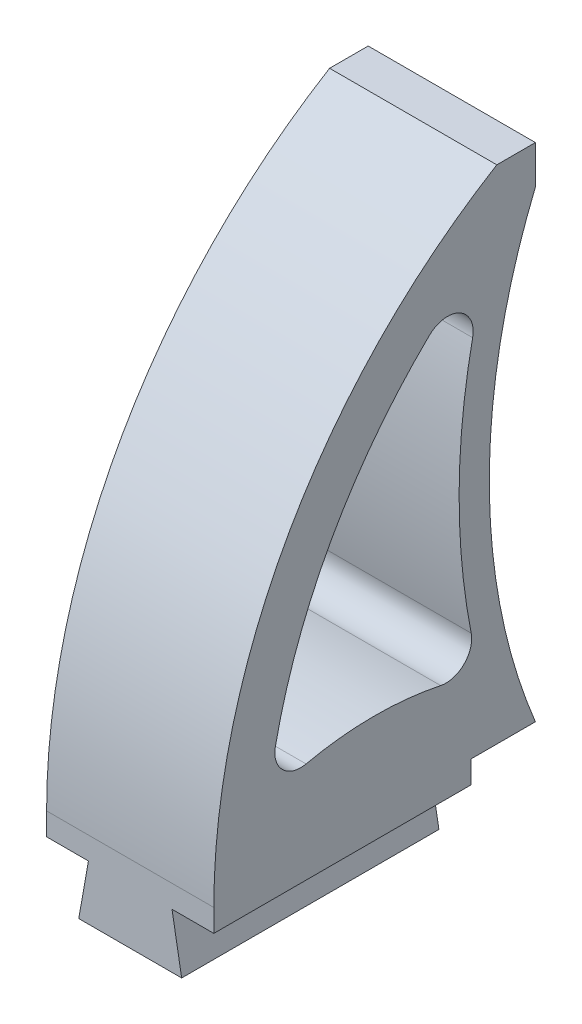
ISO-10303-21;
HEADER;
FILE_DESCRIPTION(('STEP AP214'),'2;1');
FILE_NAME('part.step','',(''),(''),'','','');
FILE_SCHEMA(('AUTOMOTIVE_DESIGN { 1 0 10303 214 1 1 1 1 }'));
ENDSEC;
DATA;
#1=APPLICATION_CONTEXT('core data for automotive mechanical design processes');
#2=APPLICATION_PROTOCOL_DEFINITION('international standard','automotive_design',2000,#1);
#3=PRODUCT_CONTEXT('',#1,'mechanical');
#4=PRODUCT('Part','Part','',(#3));
#5=PRODUCT_RELATED_PRODUCT_CATEGORY('part','',(#4));
#6=PRODUCT_DEFINITION_FORMATION('','',#4);
#7=PRODUCT_DEFINITION_CONTEXT('part definition',#1,'design');
#8=PRODUCT_DEFINITION('design','',#6,#7);
#9=PRODUCT_DEFINITION_SHAPE('','',#8);
#10=(LENGTH_UNIT() NAMED_UNIT(*) SI_UNIT(.MILLI.,.METRE.));
#11=(NAMED_UNIT(*) PLANE_ANGLE_UNIT() SI_UNIT($,.RADIAN.));
#12=(NAMED_UNIT(*) SI_UNIT($,.STERADIAN.) SOLID_ANGLE_UNIT());
#13=UNCERTAINTY_MEASURE_WITH_UNIT(LENGTH_MEASURE(1.E-05),#10,'distance_accuracy_value','');
#14=(GEOMETRIC_REPRESENTATION_CONTEXT(3) GLOBAL_UNCERTAINTY_ASSIGNED_CONTEXT((#13)) GLOBAL_UNIT_ASSIGNED_CONTEXT((#10,
#11,#12)) REPRESENTATION_CONTEXT('',''));
#15=CARTESIAN_POINT('',(0.,0.,0.));
#16=DIRECTION('',(0.,0.,1.));
#17=DIRECTION('',(1.,0.,0.));
#18=AXIS2_PLACEMENT_3D('',#15,#16,#17);
#19=CARTESIAN_POINT('',(6.5,0.,-20.));
#20=DIRECTION('',(0.,1.,0.));
#21=DIRECTION('',(0.,0.,1.));
#22=AXIS2_PLACEMENT_3D('',#19,#20,#21);
#23=PLANE('',#22);
#24=DIRECTION('',(0.,0.,1.));
#25=VECTOR('',#24,1.);
#26=CARTESIAN_POINT('',(-3.99999999999999,0.,-25.001));
#27=LINE('',#26,#25);
#28=CARTESIAN_POINT('',(-3.99999999999999,0.,-20.));
#29=VERTEX_POINT('',#28);
#30=CARTESIAN_POINT('',(-3.99999999999999,0.,0.));
#31=VERTEX_POINT('',#30);
#32=EDGE_CURVE('E223',#29,#31,#27,.T.);
#33=ORIENTED_EDGE('',*,*,#32,.F.);
#34=DIRECTION('',(-1.,0.,0.));
#35=VECTOR('',#34,1.);
#36=CARTESIAN_POINT('',(6.5,0.,-20.));
#37=LINE('',#36,#35);
#38=CARTESIAN_POINT('',(4.,0.,-20.));
#39=VERTEX_POINT('',#38);
#40=EDGE_CURVE('E11',#39,#29,#37,.T.);
#41=ORIENTED_EDGE('',*,*,#40,.F.);
#42=DIRECTION('',(0.,0.,1.));
#43=VECTOR('',#42,1.);
#44=CARTESIAN_POINT('',(4.,0.,-25.001));
#45=LINE('',#44,#43);
#46=CARTESIAN_POINT('',(4.,0.,0.));
#47=VERTEX_POINT('',#46);
#48=EDGE_CURVE('E234',#39,#47,#45,.T.);
#49=ORIENTED_EDGE('',*,*,#48,.T.);
#50=DIRECTION('',(-1.,0.,0.));
#51=VECTOR('',#50,1.);
#52=CARTESIAN_POINT('',(6.5,0.,0.));
#53=LINE('',#52,#51);
#54=EDGE_CURVE('E264',#47,#31,#53,.T.);
#55=ORIENTED_EDGE('',*,*,#54,.T.);
#56=EDGE_LOOP('',(#33,#41,#49,#55));
#57=FACE_BOUND('',#56,.T.);
#58=ADVANCED_FACE('F39',(#57),#23,.F.);
#59=CARTESIAN_POINT('',(6.5,6.,-20.));
#60=DIRECTION('',(0.,0.,1.));
#61=DIRECTION('',(1.,0.,0.));
#62=AXIS2_PLACEMENT_3D('',#59,#60,#61);
#63=PLANE('',#62);
#64=DIRECTION('',(0.173648177666928,0.984807753012208,0.));
#65=VECTOR('',#64,1.);
#66=CARTESIAN_POINT('',(-3.87938524157182,0.684040286651327,-20.));
#67=LINE('',#66,#65);
#68=CARTESIAN_POINT('',(-3.25000000000003,4.25346136471315,-20.));
#69=VERTEX_POINT('',#68);
#70=EDGE_CURVE('E212',#29,#69,#67,.T.);
#71=ORIENTED_EDGE('',*,*,#70,.T.);
#72=DIRECTION('',(-1.,0.,0.));
#73=VECTOR('',#72,1.);
#74=CARTESIAN_POINT('',(0.,4.25346136471317,-20.));
#75=LINE('',#74,#73);
#76=CARTESIAN_POINT('',(-6.5,4.25346136471313,-20.));
#77=VERTEX_POINT('',#76);
#78=EDGE_CURVE('E225',#69,#77,#75,.T.);
#79=ORIENTED_EDGE('',*,*,#78,.T.);
#80=DIRECTION('',(0.,1.,0.));
#81=VECTOR('',#80,1.);
#82=CARTESIAN_POINT('',(-6.5,6.,-20.));
#83=LINE('',#82,#81);
#84=CARTESIAN_POINT('',(-6.5,6.,-20.));
#85=VERTEX_POINT('',#84);
#86=EDGE_CURVE('E232',#77,#85,#83,.T.);
#87=ORIENTED_EDGE('',*,*,#86,.T.);
#88=DIRECTION('',(-1.,0.,0.));
#89=VECTOR('',#88,1.);
#90=CARTESIAN_POINT('',(6.5,6.,-20.));
#91=LINE('',#90,#89);
#92=CARTESIAN_POINT('',(6.5,6.,-20.));
#93=VERTEX_POINT('',#92);
#94=EDGE_CURVE('E46',#93,#85,#91,.T.);
#95=ORIENTED_EDGE('',*,*,#94,.F.);
#96=DIRECTION('',(0.,1.,0.));
#97=VECTOR('',#96,1.);
#98=CARTESIAN_POINT('',(6.5,6.,-20.));
#99=LINE('',#98,#97);
#100=CARTESIAN_POINT('',(6.5,4.25346136471317,-20.));
#101=VERTEX_POINT('',#100);
#102=EDGE_CURVE('E248',#101,#93,#99,.T.);
#103=ORIENTED_EDGE('',*,*,#102,.F.);
#104=DIRECTION('',(1.,0.,0.));
#105=VECTOR('',#104,1.);
#106=CARTESIAN_POINT('',(6.5,4.25346136471317,-20.));
#107=LINE('',#106,#105);
#108=CARTESIAN_POINT('',(3.25,4.25346136471317,-20.));
#109=VERTEX_POINT('',#108);
#110=EDGE_CURVE('E177',#109,#101,#107,.T.);
#111=ORIENTED_EDGE('',*,*,#110,.F.);
#112=DIRECTION('',(-0.173648177666935,0.984807753012207,0.));
#113=VECTOR('',#112,1.);
#114=CARTESIAN_POINT('',(3.25,4.25346136471317,-20.));
#115=LINE('',#114,#113);
#116=EDGE_CURVE('E216',#39,#109,#115,.T.);
#117=ORIENTED_EDGE('',*,*,#116,.F.);
#118=ORIENTED_EDGE('',*,*,#40,.T.);
#119=EDGE_LOOP('',(#71,#79,#87,#95,#103,#111,#117,#118));
#120=FACE_BOUND('',#119,.T.);
#121=ADVANCED_FACE('F321',(#120),#63,.F.);
#122=CARTESIAN_POINT('',(6.5,0.,0.));
#123=DIRECTION('',(0.,0.,-1.));
#124=DIRECTION('',(-1.,0.,0.));
#125=AXIS2_PLACEMENT_3D('',#122,#123,#124);
#126=PLANE('',#125);
#127=DIRECTION('',(-0.173648177666928,-0.984807753012208,0.));
#128=VECTOR('',#127,1.);
#129=CARTESIAN_POINT('',(-3.87938524157182,0.684040286651327,0.));
#130=LINE('',#129,#128);
#131=CARTESIAN_POINT('',(-3.25000000000003,4.25346136471315,0.));
#132=VERTEX_POINT('',#131);
#133=EDGE_CURVE('E215',#132,#31,#130,.T.);
#134=ORIENTED_EDGE('',*,*,#133,.T.);
#135=ORIENTED_EDGE('',*,*,#54,.F.);
#136=DIRECTION('',(0.173648177666935,-0.984807753012207,0.));
#137=VECTOR('',#136,1.);
#138=CARTESIAN_POINT('',(3.25,4.25346136471317,0.));
#139=LINE('',#138,#137);
#140=CARTESIAN_POINT('',(3.25,4.25346136471317,0.));
#141=VERTEX_POINT('',#140);
#142=EDGE_CURVE('E244',#141,#47,#139,.T.);
#143=ORIENTED_EDGE('',*,*,#142,.F.);
#144=DIRECTION('',(-1.,0.,0.));
#145=VECTOR('',#144,1.);
#146=CARTESIAN_POINT('',(6.5,4.25346136471317,0.));
#147=LINE('',#146,#145);
#148=CARTESIAN_POINT('',(6.5,4.25346136471317,0.));
#149=VERTEX_POINT('',#148);
#150=EDGE_CURVE('E241',#149,#141,#147,.T.);
#151=ORIENTED_EDGE('',*,*,#150,.F.);
#152=DIRECTION('',(0.,-1.,0.));
#153=VECTOR('',#152,1.);
#154=CARTESIAN_POINT('',(6.5,0.,0.));
#155=LINE('',#154,#153);
#156=CARTESIAN_POINT('',(6.5,6.,0.));
#157=VERTEX_POINT('',#156);
#158=EDGE_CURVE('E261',#157,#149,#155,.T.);
#159=ORIENTED_EDGE('',*,*,#158,.F.);
#160=DIRECTION('',(-1.,0.,0.));
#161=VECTOR('',#160,1.);
#162=CARTESIAN_POINT('',(6.5,6.,0.));
#163=LINE('',#162,#161);
#164=CARTESIAN_POINT('',(-6.5,6.,0.));
#165=VERTEX_POINT('',#164);
#166=EDGE_CURVE('E280',#157,#165,#163,.T.);
#167=ORIENTED_EDGE('',*,*,#166,.T.);
#168=DIRECTION('',(0.,-1.,0.));
#169=VECTOR('',#168,1.);
#170=CARTESIAN_POINT('',(-6.5,0.,0.));
#171=LINE('',#170,#169);
#172=CARTESIAN_POINT('',(-6.5,4.25346136471315,0.));
#173=VERTEX_POINT('',#172);
#174=EDGE_CURVE('E251',#165,#173,#171,.T.);
#175=ORIENTED_EDGE('',*,*,#174,.T.);
#176=DIRECTION('',(1.,0.,0.));
#177=VECTOR('',#176,1.);
#178=CARTESIAN_POINT('',(0.,4.25346136471317,0.));
#179=LINE('',#178,#177);
#180=EDGE_CURVE('E219',#173,#132,#179,.T.);
#181=ORIENTED_EDGE('',*,*,#180,.T.);
#182=EDGE_LOOP('',(#134,#135,#143,#151,#159,#167,#175,#181));
#183=FACE_BOUND('',#182,.T.);
#184=ADVANCED_FACE('F334',(#183),#126,.F.);
#185=CARTESIAN_POINT('',(-6.5,6.,-45.5681818181818));
#186=DIRECTION('',(1.,0.,0.));
#187=DIRECTION('',(0.,0.,-1.));
#188=AXIS2_PLACEMENT_3D('',#185,#186,#187);
#189=PLANE('',#188);
#190=CARTESIAN_POINT('',(-6.5,24.1044855795233,-69.070297770506));
#191=DIRECTION('',(1.,0.,0.));
#192=DIRECTION('',(0.,0.,-1.));
#193=AXIS2_PLACEMENT_3D('',#190,#191,#192);
#194=CIRCLE('',#193,50.);
#195=CARTESIAN_POINT('',(-6.5,34.3028962432529,-20.1214221967614));
#196=VERTEX_POINT('',#195);
#197=CARTESIAN_POINT('',(-6.5,14.4638203331186,-20.0085247327654));
#198=VERTEX_POINT('',#197);
#199=EDGE_CURVE('E184',#196,#198,#194,.T.);
#200=ORIENTED_EDGE('',*,*,#199,.F.);
#201=CARTESIAN_POINT('',(-6.5,34.7108326698021,-18.1634671738116));
#202=DIRECTION('',(1.,0.,0.));
#203=DIRECTION('',(0.,0.,-1.));
#204=AXIS2_PLACEMENT_3D('',#201,#202,#203);
#205=CIRCLE('',#204,2.);
#206=CARTESIAN_POINT('',(-6.5,36.1515813933143,-16.7762962702464));
#207=VERTEX_POINT('',#206);
#208=EDGE_CURVE('E165',#207,#196,#205,.F.);
#209=ORIENTED_EDGE('',*,*,#208,.F.);
#210=CARTESIAN_POINT('',(-6.5,5.89585819955734,-45.9068852451154));
#211=DIRECTION('',(1.,0.,0.));
#212=DIRECTION('',(0.,0.,-1.));
#213=AXIS2_PLACEMENT_3D('',#210,#211,#212);
#214=CIRCLE('',#213,42.);
#215=CARTESIAN_POINT('',(-6.5,14.4399701025535,-4.78513732763162));
#216=VERTEX_POINT('',#215);
#217=EDGE_CURVE('E174',#216,#207,#214,.F.);
#218=ORIENTED_EDGE('',*,*,#217,.F.);
#219=CARTESIAN_POINT('',(-6.5,14.0331076309822,-6.74331579989276));
#220=DIRECTION('',(1.,0.,0.));
#221=DIRECTION('',(0.,0.,-1.));
#222=AXIS2_PLACEMENT_3D('',#219,#220,#221);
#223=CIRCLE('',#222,2.);
#224=CARTESIAN_POINT('',(-6.5,12.0790950704978,-7.16973685175255));
#225=VERTEX_POINT('',#224);
#226=EDGE_CURVE('E53',#225,#216,#223,.F.);
#227=ORIENTED_EDGE('',*,*,#226,.F.);
#228=CARTESIAN_POINT('',(-6.5,-12.3460619355571,-12.5));
#229=DIRECTION('',(1.,0.,0.));
#230=DIRECTION('',(0.,0.,-1.));
#231=AXIS2_PLACEMENT_3D('',#228,#229,#230);
#232=CIRCLE('',#231,25.);
#233=CARTESIAN_POINT('',(-6.5,12.1208414522387,-17.635235010422));
#234=VERTEX_POINT('',#233);
#235=EDGE_CURVE('E512',#234,#225,#232,.T.);
#236=ORIENTED_EDGE('',*,*,#235,.F.);
#237=CARTESIAN_POINT('',(-6.5,14.0781937232624,-18.0460538112558));
#238=DIRECTION('',(1.,0.,0.));
#239=DIRECTION('',(0.,0.,-1.));
#240=AXIS2_PLACEMENT_3D('',#237,#238,#239);
#241=CIRCLE('',#240,2.);
#242=EDGE_CURVE('E188',#198,#234,#241,.F.);
#243=ORIENTED_EDGE('',*,*,#242,.F.);
#244=EDGE_LOOP('',(#200,#209,#218,#227,#236,#243));
#245=FACE_BOUND('',#244,.T.);
#246=DIRECTION('',(0.,0.,1.));
#247=VECTOR('',#246,1.);
#248=CARTESIAN_POINT('',(-6.5,4.25346136471313,-25.001));
#249=LINE('',#248,#247);
#250=EDGE_CURVE('E226',#77,#173,#249,.T.);
#251=ORIENTED_EDGE('',*,*,#250,.T.);
#252=ORIENTED_EDGE('',*,*,#174,.F.);
#253=CARTESIAN_POINT('',(-6.5,6.,-45.5681818181818));
#254=DIRECTION('',(1.,0.,0.));
#255=DIRECTION('',(0.,0.,-1.));
#256=AXIS2_PLACEMENT_3D('',#253,#254,#255);
#257=CIRCLE('',#256,45.5681818181818);
#258=CARTESIAN_POINT('',(-6.5,45.,-22.));
#259=VERTEX_POINT('',#258);
#260=EDGE_CURVE('E274',#259,#165,#257,.T.);
#261=ORIENTED_EDGE('',*,*,#260,.F.);
#262=DIRECTION('',(0.,0.,1.));
#263=VECTOR('',#262,1.);
#264=CARTESIAN_POINT('',(-6.5,45.,-22.));
#265=LINE('',#264,#263);
#266=CARTESIAN_POINT('',(-6.5,45.,-25.));
#267=VERTEX_POINT('',#266);
#268=EDGE_CURVE('E272',#267,#259,#265,.T.);
#269=ORIENTED_EDGE('',*,*,#268,.F.);
#270=DIRECTION('',(0.,1.,0.));
#271=VECTOR('',#270,1.);
#272=CARTESIAN_POINT('',(-6.5,45.,-25.));
#273=LINE('',#272,#271);
#274=CARTESIAN_POINT('',(-6.5,42.,-25.));
#275=VERTEX_POINT('',#274);
#276=EDGE_CURVE('E270',#275,#267,#273,.T.);
#277=ORIENTED_EDGE('',*,*,#276,.F.);
#278=CARTESIAN_POINT('',(-6.5,24.,-68.4165866921848));
#279=DIRECTION('',(-1.,0.,0.));
#280=DIRECTION('',(0.,0.,-1.));
#281=AXIS2_PLACEMENT_3D('',#278,#279,#280);
#282=CIRCLE('',#281,47.);
#283=CARTESIAN_POINT('',(-6.5,6.00000000000001,-25.));
#284=VERTEX_POINT('',#283);
#285=EDGE_CURVE('E268',#284,#275,#282,.T.);
#286=ORIENTED_EDGE('',*,*,#285,.F.);
#287=DIRECTION('',(0.,0.,-1.));
#288=VECTOR('',#287,1.);
#289=CARTESIAN_POINT('',(-6.5,6.,-25.));
#290=LINE('',#289,#288);
#291=EDGE_CURVE('E266',#85,#284,#290,.T.);
#292=ORIENTED_EDGE('',*,*,#291,.F.);
#293=ORIENTED_EDGE('',*,*,#86,.F.);
#294=EDGE_LOOP('',(#251,#252,#261,#269,#277,#286,#292,#293));
#295=FACE_BOUND('',#294,.T.);
#296=ADVANCED_FACE('F180',(#245,#295),#189,.F.);
#297=CARTESIAN_POINT('',(6.5,6.,-25.));
#298=DIRECTION('',(0.,1.,0.));
#299=DIRECTION('',(0.,0.,1.));
#300=AXIS2_PLACEMENT_3D('',#297,#298,#299);
#301=PLANE('',#300);
#302=ORIENTED_EDGE('',*,*,#291,.T.);
#303=DIRECTION('',(-1.,0.,0.));
#304=VECTOR('',#303,1.);
#305=CARTESIAN_POINT('',(6.5,6.00000000000001,-25.));
#306=LINE('',#305,#304);
#307=CARTESIAN_POINT('',(6.5,6.00000000000001,-25.));
#308=VERTEX_POINT('',#307);
#309=EDGE_CURVE('E292',#308,#284,#306,.T.);
#310=ORIENTED_EDGE('',*,*,#309,.F.);
#311=DIRECTION('',(0.,0.,-1.));
#312=VECTOR('',#311,1.);
#313=CARTESIAN_POINT('',(6.5,6.,-25.));
#314=LINE('',#313,#312);
#315=EDGE_CURVE('E250',#93,#308,#314,.T.);
#316=ORIENTED_EDGE('',*,*,#315,.F.);
#317=ORIENTED_EDGE('',*,*,#94,.T.);
#318=EDGE_LOOP('',(#302,#310,#316,#317));
#319=FACE_BOUND('',#318,.T.);
#320=ADVANCED_FACE('F299',(#319),#301,.F.);
#321=CARTESIAN_POINT('',(6.5,24.,-68.4165866921848));
#322=DIRECTION('',(-1.,0.,0.));
#323=DIRECTION('',(0.,0.,1.));
#324=AXIS2_PLACEMENT_3D('',#321,#322,#323);
#325=CYLINDRICAL_SURFACE('',#324,47.);
#326=ORIENTED_EDGE('',*,*,#285,.T.);
#327=DIRECTION('',(-1.,0.,0.));
#328=VECTOR('',#327,1.);
#329=CARTESIAN_POINT('',(6.5,42.,-25.));
#330=LINE('',#329,#328);
#331=CARTESIAN_POINT('',(6.5,42.,-25.));
#332=VERTEX_POINT('',#331);
#333=EDGE_CURVE('E289',#332,#275,#330,.T.);
#334=ORIENTED_EDGE('',*,*,#333,.F.);
#335=CARTESIAN_POINT('',(6.5,24.,-68.4165866921848));
#336=DIRECTION('',(-1.,0.,0.));
#337=DIRECTION('',(0.,0.,-1.));
#338=AXIS2_PLACEMENT_3D('',#335,#336,#337);
#339=CIRCLE('',#338,47.);
#340=EDGE_CURVE('E253',#308,#332,#339,.T.);
#341=ORIENTED_EDGE('',*,*,#340,.F.);
#342=ORIENTED_EDGE('',*,*,#309,.T.);
#343=EDGE_LOOP('',(#326,#334,#341,#342));
#344=FACE_BOUND('',#343,.T.);
#345=ADVANCED_FACE('F309',(#344),#325,.F.);
#346=CARTESIAN_POINT('',(6.5,45.,-25.));
#347=DIRECTION('',(0.,0.,1.));
#348=DIRECTION('',(1.,0.,0.));
#349=AXIS2_PLACEMENT_3D('',#346,#347,#348);
#350=PLANE('',#349);
#351=ORIENTED_EDGE('',*,*,#276,.T.);
#352=DIRECTION('',(-1.,0.,0.));
#353=VECTOR('',#352,1.);
#354=CARTESIAN_POINT('',(6.5,45.,-25.));
#355=LINE('',#354,#353);
#356=CARTESIAN_POINT('',(6.5,45.,-25.));
#357=VERTEX_POINT('',#356);
#358=EDGE_CURVE('E286',#357,#267,#355,.T.);
#359=ORIENTED_EDGE('',*,*,#358,.F.);
#360=DIRECTION('',(0.,1.,0.));
#361=VECTOR('',#360,1.);
#362=CARTESIAN_POINT('',(6.5,45.,-25.));
#363=LINE('',#362,#361);
#364=EDGE_CURVE('E255',#332,#357,#363,.T.);
#365=ORIENTED_EDGE('',*,*,#364,.F.);
#366=ORIENTED_EDGE('',*,*,#333,.T.);
#367=EDGE_LOOP('',(#351,#359,#365,#366));
#368=FACE_BOUND('',#367,.T.);
#369=ADVANCED_FACE('F313',(#368),#350,.F.);
#370=CARTESIAN_POINT('',(6.5,45.,-22.));
#371=DIRECTION('',(0.,-1.,0.));
#372=DIRECTION('',(0.,0.,-1.));
#373=AXIS2_PLACEMENT_3D('',#370,#371,#372);
#374=PLANE('',#373);
#375=ORIENTED_EDGE('',*,*,#268,.T.);
#376=DIRECTION('',(-1.,0.,0.));
#377=VECTOR('',#376,1.);
#378=CARTESIAN_POINT('',(6.5,45.,-22.));
#379=LINE('',#378,#377);
#380=CARTESIAN_POINT('',(6.5,45.,-22.));
#381=VERTEX_POINT('',#380);
#382=EDGE_CURVE('E283',#381,#259,#379,.T.);
#383=ORIENTED_EDGE('',*,*,#382,.F.);
#384=DIRECTION('',(0.,0.,1.));
#385=VECTOR('',#384,1.);
#386=CARTESIAN_POINT('',(6.5,45.,-22.));
#387=LINE('',#386,#385);
#388=EDGE_CURVE('E257',#357,#381,#387,.T.);
#389=ORIENTED_EDGE('',*,*,#388,.F.);
#390=ORIENTED_EDGE('',*,*,#358,.T.);
#391=EDGE_LOOP('',(#375,#383,#389,#390));
#392=FACE_BOUND('',#391,.T.);
#393=ADVANCED_FACE('F349',(#392),#374,.F.);
#394=CARTESIAN_POINT('',(6.5,6.,-45.5681818181818));
#395=DIRECTION('',(-1.,0.,0.));
#396=DIRECTION('',(0.,0.,1.));
#397=AXIS2_PLACEMENT_3D('',#394,#395,#396);
#398=CYLINDRICAL_SURFACE('',#397,45.5681818181818);
#399=ORIENTED_EDGE('',*,*,#260,.T.);
#400=ORIENTED_EDGE('',*,*,#166,.F.);
#401=CARTESIAN_POINT('',(6.5,6.,-45.5681818181818));
#402=DIRECTION('',(1.,0.,0.));
#403=DIRECTION('',(0.,0.,-1.));
#404=AXIS2_PLACEMENT_3D('',#401,#402,#403);
#405=CIRCLE('',#404,45.5681818181818);
#406=EDGE_CURVE('E259',#381,#157,#405,.T.);
#407=ORIENTED_EDGE('',*,*,#406,.F.);
#408=ORIENTED_EDGE('',*,*,#382,.T.);
#409=EDGE_LOOP('',(#399,#400,#407,#408));
#410=FACE_BOUND('',#409,.T.);
#411=ADVANCED_FACE('F347',(#410),#398,.T.);
#412=CARTESIAN_POINT('',(6.5,6.,-45.5681818181818));
#413=DIRECTION('',(1.,0.,0.));
#414=DIRECTION('',(0.,0.,-1.));
#415=AXIS2_PLACEMENT_3D('',#412,#413,#414);
#416=PLANE('',#415);
#417=CARTESIAN_POINT('',(6.5,34.7108326698021,-18.1634671738116));
#418=DIRECTION('',(1.,0.,0.));
#419=DIRECTION('',(0.,0.,1.));
#420=AXIS2_PLACEMENT_3D('',#417,#418,#419);
#421=CIRCLE('',#420,2.);
#422=CARTESIAN_POINT('',(6.5,34.3028962432529,-20.1214221967614));
#423=VERTEX_POINT('',#422);
#424=CARTESIAN_POINT('',(6.5,36.1515813933143,-16.7762962702464));
#425=VERTEX_POINT('',#424);
#426=EDGE_CURVE('E61',#423,#425,#421,.T.);
#427=ORIENTED_EDGE('',*,*,#426,.F.);
#428=CARTESIAN_POINT('',(6.5,24.1044855795233,-69.070297770506));
#429=DIRECTION('',(-1.,0.,0.));
#430=DIRECTION('',(0.,0.,1.));
#431=AXIS2_PLACEMENT_3D('',#428,#429,#430);
#432=CIRCLE('',#431,50.);
#433=CARTESIAN_POINT('',(6.5,14.4638203331186,-20.0085247327654));
#434=VERTEX_POINT('',#433);
#435=EDGE_CURVE('E171',#434,#423,#432,.T.);
#436=ORIENTED_EDGE('',*,*,#435,.F.);
#437=CARTESIAN_POINT('',(6.5,14.0781937232624,-18.0460538112558));
#438=DIRECTION('',(1.,0.,0.));
#439=DIRECTION('',(0.,0.,1.));
#440=AXIS2_PLACEMENT_3D('',#437,#438,#439);
#441=CIRCLE('',#440,2.);
#442=CARTESIAN_POINT('',(6.5,12.1208414522387,-17.635235010422));
#443=VERTEX_POINT('',#442);
#444=EDGE_CURVE('E199',#443,#434,#441,.T.);
#445=ORIENTED_EDGE('',*,*,#444,.F.);
#446=CARTESIAN_POINT('',(6.5,-12.3460619355571,-12.5));
#447=DIRECTION('',(-1.,0.,0.));
#448=DIRECTION('',(0.,0.,1.));
#449=AXIS2_PLACEMENT_3D('',#446,#447,#448);
#450=CIRCLE('',#449,25.);
#451=CARTESIAN_POINT('',(6.5,12.0790950704978,-7.16973685175255));
#452=VERTEX_POINT('',#451);
#453=EDGE_CURVE('E196',#452,#443,#450,.T.);
#454=ORIENTED_EDGE('',*,*,#453,.F.);
#455=CARTESIAN_POINT('',(6.5,14.0331076309822,-6.74331579989276));
#456=DIRECTION('',(1.,0.,0.));
#457=DIRECTION('',(0.,0.,1.));
#458=AXIS2_PLACEMENT_3D('',#455,#456,#457);
#459=CIRCLE('',#458,2.);
#460=CARTESIAN_POINT('',(6.5,14.4399701025535,-4.78513732763162));
#461=VERTEX_POINT('',#460);
#462=EDGE_CURVE('E193',#461,#452,#459,.T.);
#463=ORIENTED_EDGE('',*,*,#462,.F.);
#464=CARTESIAN_POINT('',(6.5,5.89585819955734,-45.9068852451154));
#465=DIRECTION('',(1.,0.,0.));
#466=DIRECTION('',(0.,0.,-1.));
#467=AXIS2_PLACEMENT_3D('',#464,#465,#466);
#468=CIRCLE('',#467,42.);
#469=EDGE_CURVE('E186',#425,#461,#468,.T.);
#470=ORIENTED_EDGE('',*,*,#469,.F.);
#471=EDGE_LOOP('',(#427,#436,#445,#454,#463,#470));
#472=FACE_BOUND('',#471,.T.);
#473=DIRECTION('',(0.,0.,1.));
#474=VECTOR('',#473,1.);
#475=CARTESIAN_POINT('',(6.5,4.25346136471317,-25.001));
#476=LINE('',#475,#474);
#477=EDGE_CURVE('E239',#101,#149,#476,.T.);
#478=ORIENTED_EDGE('',*,*,#477,.F.);
#479=ORIENTED_EDGE('',*,*,#102,.T.);
#480=ORIENTED_EDGE('',*,*,#315,.T.);
#481=ORIENTED_EDGE('',*,*,#340,.T.);
#482=ORIENTED_EDGE('',*,*,#364,.T.);
#483=ORIENTED_EDGE('',*,*,#388,.T.);
#484=ORIENTED_EDGE('',*,*,#406,.T.);
#485=ORIENTED_EDGE('',*,*,#158,.T.);
#486=EDGE_LOOP('',(#478,#479,#480,#481,#482,#483,#484,#485));
#487=FACE_BOUND('',#486,.T.);
#488=ADVANCED_FACE('F318',(#472,#487),#416,.T.);
#489=CARTESIAN_POINT('',(-3.87938524157182,0.684040286651327,-25.001));
#490=DIRECTION('',(-0.984807753012209,0.173648177666928,0.));
#491=DIRECTION('',(-0.173648177666928,-0.984807753012209,0.));
#492=AXIS2_PLACEMENT_3D('',#489,#490,#491);
#493=PLANE('',#492);
#494=ORIENTED_EDGE('',*,*,#32,.T.);
#495=ORIENTED_EDGE('',*,*,#133,.F.);
#496=DIRECTION('',(0.,0.,1.));
#497=VECTOR('',#496,1.);
#498=CARTESIAN_POINT('',(-3.25000000000003,4.25346136471315,-25.001));
#499=LINE('',#498,#497);
#500=EDGE_CURVE('E222',#69,#132,#499,.T.);
#501=ORIENTED_EDGE('',*,*,#500,.F.);
#502=ORIENTED_EDGE('',*,*,#70,.F.);
#503=EDGE_LOOP('',(#494,#495,#501,#502));
#504=FACE_BOUND('',#503,.T.);
#505=ADVANCED_FACE('F338',(#504),#493,.T.);
#506=CARTESIAN_POINT('',(0.,4.25346136471317,-25.001));
#507=DIRECTION('',(0.,-1.,0.));
#508=DIRECTION('',(1.,0.,0.));
#509=AXIS2_PLACEMENT_3D('',#506,#507,#508);
#510=PLANE('',#509);
#511=ORIENTED_EDGE('',*,*,#500,.T.);
#512=ORIENTED_EDGE('',*,*,#180,.F.);
#513=ORIENTED_EDGE('',*,*,#250,.F.);
#514=ORIENTED_EDGE('',*,*,#78,.F.);
#515=EDGE_LOOP('',(#511,#512,#513,#514));
#516=FACE_BOUND('',#515,.T.);
#517=ADVANCED_FACE('F340',(#516),#510,.T.);
#518=CARTESIAN_POINT('',(3.25,4.25346136471317,-25.001));
#519=DIRECTION('',(-0.984807753012207,-0.173648177666935,0.));
#520=DIRECTION('',(0.173648177666935,-0.984807753012207,0.));
#521=AXIS2_PLACEMENT_3D('',#518,#519,#520);
#522=PLANE('',#521);
#523=ORIENTED_EDGE('',*,*,#116,.T.);
#524=DIRECTION('',(0.,0.,1.));
#525=VECTOR('',#524,1.);
#526=CARTESIAN_POINT('',(3.25,4.25346136471317,-25.001));
#527=LINE('',#526,#525);
#528=EDGE_CURVE('E237',#109,#141,#527,.T.);
#529=ORIENTED_EDGE('',*,*,#528,.T.);
#530=ORIENTED_EDGE('',*,*,#142,.T.);
#531=ORIENTED_EDGE('',*,*,#48,.F.);
#532=EDGE_LOOP('',(#523,#529,#530,#531));
#533=FACE_BOUND('',#532,.T.);
#534=ADVANCED_FACE('F329',(#533),#522,.F.);
#535=CARTESIAN_POINT('',(6.5,4.25346136471317,-25.001));
#536=DIRECTION('',(0.,1.,0.));
#537=DIRECTION('',(0.,0.,1.));
#538=AXIS2_PLACEMENT_3D('',#535,#536,#537);
#539=PLANE('',#538);
#540=ORIENTED_EDGE('',*,*,#110,.T.);
#541=ORIENTED_EDGE('',*,*,#477,.T.);
#542=ORIENTED_EDGE('',*,*,#150,.T.);
#543=ORIENTED_EDGE('',*,*,#528,.F.);
#544=EDGE_LOOP('',(#540,#541,#542,#543));
#545=FACE_BOUND('',#544,.T.);
#546=ADVANCED_FACE('F325',(#545),#539,.F.);
#547=CARTESIAN_POINT('',(-6.501,34.7108326698021,-18.1634671738116));
#548=DIRECTION('',(1.,0.,0.));
#549=DIRECTION('',(0.,0.,-1.));
#550=AXIS2_PLACEMENT_3D('',#547,#548,#549);
#551=CYLINDRICAL_SURFACE('',#550,2.);
#552=ORIENTED_EDGE('',*,*,#208,.T.);
#553=DIRECTION('',(1.,0.,0.));
#554=VECTOR('',#553,1.);
#555=CARTESIAN_POINT('',(-6.501,34.3028962432529,-20.1214221967614));
#556=LINE('',#555,#554);
#557=EDGE_CURVE('E178',#196,#423,#556,.T.);
#558=ORIENTED_EDGE('',*,*,#557,.T.);
#559=ORIENTED_EDGE('',*,*,#426,.T.);
#560=DIRECTION('',(1.,0.,0.));
#561=VECTOR('',#560,1.);
#562=CARTESIAN_POINT('',(-6.501,36.1515813933143,-16.7762962702464));
#563=LINE('',#562,#561);
#564=EDGE_CURVE('E161',#207,#425,#563,.T.);
#565=ORIENTED_EDGE('',*,*,#564,.F.);
#566=EDGE_LOOP('',(#552,#558,#559,#565));
#567=FACE_BOUND('',#566,.T.);
#568=ADVANCED_FACE('F163',(#567),#551,.F.);
#569=CARTESIAN_POINT('',(-6.501,24.1044855795233,-69.070297770506));
#570=DIRECTION('',(1.,0.,0.));
#571=DIRECTION('',(0.,0.,-1.));
#572=AXIS2_PLACEMENT_3D('',#569,#570,#571);
#573=CYLINDRICAL_SURFACE('',#572,50.);
#574=ORIENTED_EDGE('',*,*,#199,.T.);
#575=DIRECTION('',(1.,0.,0.));
#576=VECTOR('',#575,1.);
#577=CARTESIAN_POINT('',(-6.501,14.4638203331186,-20.0085247327654));
#578=LINE('',#577,#576);
#579=EDGE_CURVE('E205',#198,#434,#578,.T.);
#580=ORIENTED_EDGE('',*,*,#579,.T.);
#581=ORIENTED_EDGE('',*,*,#435,.T.);
#582=ORIENTED_EDGE('',*,*,#557,.F.);
#583=EDGE_LOOP('',(#574,#580,#581,#582));
#584=FACE_BOUND('',#583,.T.);
#585=ADVANCED_FACE('F460',(#584),#573,.T.);
#586=CARTESIAN_POINT('',(-6.501,14.0781937232624,-18.0460538112558));
#587=DIRECTION('',(1.,0.,0.));
#588=DIRECTION('',(0.,0.,-1.));
#589=AXIS2_PLACEMENT_3D('',#586,#587,#588);
#590=CYLINDRICAL_SURFACE('',#589,2.);
#591=ORIENTED_EDGE('',*,*,#242,.T.);
#592=DIRECTION('',(1.,0.,0.));
#593=VECTOR('',#592,1.);
#594=CARTESIAN_POINT('',(-6.501,12.1208414522387,-17.635235010422));
#595=LINE('',#594,#593);
#596=EDGE_CURVE('E207',#234,#443,#595,.T.);
#597=ORIENTED_EDGE('',*,*,#596,.T.);
#598=ORIENTED_EDGE('',*,*,#444,.T.);
#599=ORIENTED_EDGE('',*,*,#579,.F.);
#600=EDGE_LOOP('',(#591,#597,#598,#599));
#601=FACE_BOUND('',#600,.T.);
#602=ADVANCED_FACE('F469',(#601),#590,.F.);
#603=CARTESIAN_POINT('',(-6.501,-12.3460619355571,-12.5));
#604=DIRECTION('',(1.,0.,0.));
#605=DIRECTION('',(0.,0.,-1.));
#606=AXIS2_PLACEMENT_3D('',#603,#604,#605);
#607=CYLINDRICAL_SURFACE('',#606,25.);
#608=ORIENTED_EDGE('',*,*,#235,.T.);
#609=DIRECTION('',(1.,0.,0.));
#610=VECTOR('',#609,1.);
#611=CARTESIAN_POINT('',(-6.501,12.0790950704978,-7.16973685175255));
#612=LINE('',#611,#610);
#613=EDGE_CURVE('E209',#225,#452,#612,.T.);
#614=ORIENTED_EDGE('',*,*,#613,.T.);
#615=ORIENTED_EDGE('',*,*,#453,.T.);
#616=ORIENTED_EDGE('',*,*,#596,.F.);
#617=EDGE_LOOP('',(#608,#614,#615,#616));
#618=FACE_BOUND('',#617,.T.);
#619=ADVANCED_FACE('F479',(#618),#607,.T.);
#620=CARTESIAN_POINT('',(-6.501,14.0331076309822,-6.74331579989276));
#621=DIRECTION('',(1.,0.,0.));
#622=DIRECTION('',(0.,0.,-1.));
#623=AXIS2_PLACEMENT_3D('',#620,#621,#622);
#624=CYLINDRICAL_SURFACE('',#623,2.);
#625=ORIENTED_EDGE('',*,*,#226,.T.);
#626=DIRECTION('',(1.,0.,0.));
#627=VECTOR('',#626,1.);
#628=CARTESIAN_POINT('',(-6.501,14.4399701025535,-4.78513732763162));
#629=LINE('',#628,#627);
#630=EDGE_CURVE('E170',#216,#461,#629,.T.);
#631=ORIENTED_EDGE('',*,*,#630,.T.);
#632=ORIENTED_EDGE('',*,*,#462,.T.);
#633=ORIENTED_EDGE('',*,*,#613,.F.);
#634=EDGE_LOOP('',(#625,#631,#632,#633));
#635=FACE_BOUND('',#634,.T.);
#636=ADVANCED_FACE('F489',(#635),#624,.F.);
#637=CARTESIAN_POINT('',(-6.501,5.89585819955734,-45.9068852451154));
#638=DIRECTION('',(1.,0.,0.));
#639=DIRECTION('',(0.,0.,-1.));
#640=AXIS2_PLACEMENT_3D('',#637,#638,#639);
#641=CYLINDRICAL_SURFACE('',#640,42.);
#642=ORIENTED_EDGE('',*,*,#217,.T.);
#643=ORIENTED_EDGE('',*,*,#564,.T.);
#644=ORIENTED_EDGE('',*,*,#469,.T.);
#645=ORIENTED_EDGE('',*,*,#630,.F.);
#646=EDGE_LOOP('',(#642,#643,#644,#645));
#647=FACE_BOUND('',#646,.T.);
#648=ADVANCED_FACE('F175',(#647),#641,.F.);
#649=CLOSED_SHELL('',(#58,#121,#184,#296,#320,#345,#369,#393,#411,#488,#505,#517,#534,#546,#568,
#585,#602,#619,#636,#648));
#650=MANIFOLD_SOLID_BREP('B2',#649);
#651=ADVANCED_BREP_SHAPE_REPRESENTATION('',(#18,#650),#14);
#652=SHAPE_DEFINITION_REPRESENTATION(#9,#651);
ENDSEC;
END-ISO-10303-21;
